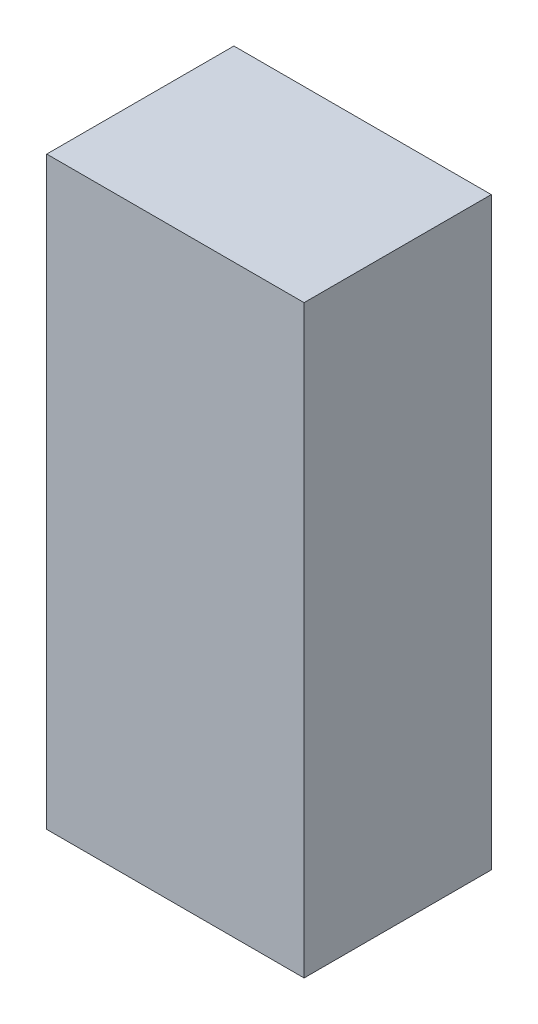
ISO-10303-21;
HEADER;
FILE_DESCRIPTION(('STEP AP214'),'2;1');
FILE_NAME('part.step','',(''),(''),'','','');
FILE_SCHEMA(('AUTOMOTIVE_DESIGN { 1 0 10303 214 1 1 1 1 }'));
ENDSEC;
DATA;
#1=APPLICATION_CONTEXT('core data for automotive mechanical design processes');
#2=APPLICATION_PROTOCOL_DEFINITION('international standard','automotive_design',2000,#1);
#3=PRODUCT_CONTEXT('',#1,'mechanical');
#4=PRODUCT('Part','Part','',(#3));
#5=PRODUCT_RELATED_PRODUCT_CATEGORY('part','',(#4));
#6=PRODUCT_DEFINITION_FORMATION('','',#4);
#7=PRODUCT_DEFINITION_CONTEXT('part definition',#1,'design');
#8=PRODUCT_DEFINITION('design','',#6,#7);
#9=PRODUCT_DEFINITION_SHAPE('','',#8);
#10=(LENGTH_UNIT() NAMED_UNIT(*) SI_UNIT(.MILLI.,.METRE.));
#11=(NAMED_UNIT(*) PLANE_ANGLE_UNIT() SI_UNIT($,.RADIAN.));
#12=(NAMED_UNIT(*) SI_UNIT($,.STERADIAN.) SOLID_ANGLE_UNIT());
#13=UNCERTAINTY_MEASURE_WITH_UNIT(LENGTH_MEASURE(1.E-05),#10,'distance_accuracy_value','');
#14=(GEOMETRIC_REPRESENTATION_CONTEXT(3) GLOBAL_UNCERTAINTY_ASSIGNED_CONTEXT((#13)) GLOBAL_UNIT_ASSIGNED_CONTEXT((#10,
#11,#12)) REPRESENTATION_CONTEXT('',''));
#15=CARTESIAN_POINT('',(0.,0.,0.));
#16=DIRECTION('',(0.,0.,1.));
#17=DIRECTION('',(1.,0.,0.));
#18=AXIS2_PLACEMENT_3D('',#15,#16,#17);
#19=CARTESIAN_POINT('',(33.,-75.,24.));
#20=DIRECTION('',(-1.,0.,0.));
#21=DIRECTION('',(0.,0.,1.));
#22=AXIS2_PLACEMENT_3D('',#19,#20,#21);
#23=PLANE('',#22);
#24=DIRECTION('',(0.,1.,0.));
#25=VECTOR('',#24,1.);
#26=CARTESIAN_POINT('',(33.,-75.,-24.));
#27=LINE('',#26,#25);
#28=CARTESIAN_POINT('',(33.,-75.,-24.));
#29=VERTEX_POINT('',#28);
#30=CARTESIAN_POINT('',(33.,75.,-24.));
#31=VERTEX_POINT('',#30);
#32=EDGE_CURVE('E112',#29,#31,#27,.T.);
#33=ORIENTED_EDGE('',*,*,#32,.T.);
#34=DIRECTION('',(0.,0.,-1.));
#35=VECTOR('',#34,1.);
#36=CARTESIAN_POINT('',(33.,75.,24.));
#37=LINE('',#36,#35);
#38=CARTESIAN_POINT('',(33.,75.,24.));
#39=VERTEX_POINT('',#38);
#40=EDGE_CURVE('E11',#39,#31,#37,.T.);
#41=ORIENTED_EDGE('',*,*,#40,.F.);
#42=DIRECTION('',(0.,1.,0.));
#43=VECTOR('',#42,1.);
#44=CARTESIAN_POINT('',(33.,-75.,24.));
#45=LINE('',#44,#43);
#46=CARTESIAN_POINT('',(33.,-75.,24.));
#47=VERTEX_POINT('',#46);
#48=EDGE_CURVE('E92',#47,#39,#45,.T.);
#49=ORIENTED_EDGE('',*,*,#48,.F.);
#50=DIRECTION('',(0.,0.,-1.));
#51=VECTOR('',#50,1.);
#52=CARTESIAN_POINT('',(33.,-75.,24.));
#53=LINE('',#52,#51);
#54=EDGE_CURVE('E110',#47,#29,#53,.T.);
#55=ORIENTED_EDGE('',*,*,#54,.T.);
#56=EDGE_LOOP('',(#33,#41,#49,#55));
#57=FACE_BOUND('',#56,.T.);
#58=ADVANCED_FACE('F43',(#57),#23,.F.);
#59=CARTESIAN_POINT('',(-33.,75.,24.));
#60=DIRECTION('',(0.,-1.,0.));
#61=DIRECTION('',(0.,0.,-1.));
#62=AXIS2_PLACEMENT_3D('',#59,#60,#61);
#63=PLANE('',#62);
#64=DIRECTION('',(-1.,0.,0.));
#65=VECTOR('',#64,1.);
#66=CARTESIAN_POINT('',(-33.,75.,-24.));
#67=LINE('',#66,#65);
#68=CARTESIAN_POINT('',(-33.,75.,-24.));
#69=VERTEX_POINT('',#68);
#70=EDGE_CURVE('E99',#31,#69,#67,.T.);
#71=ORIENTED_EDGE('',*,*,#70,.T.);
#72=DIRECTION('',(0.,0.,-1.));
#73=VECTOR('',#72,1.);
#74=CARTESIAN_POINT('',(-33.,75.,24.));
#75=LINE('',#74,#73);
#76=CARTESIAN_POINT('',(-33.,75.,24.));
#77=VERTEX_POINT('',#76);
#78=EDGE_CURVE('E55',#77,#69,#75,.T.);
#79=ORIENTED_EDGE('',*,*,#78,.F.);
#80=DIRECTION('',(-1.,0.,0.));
#81=VECTOR('',#80,1.);
#82=CARTESIAN_POINT('',(-33.,75.,24.));
#83=LINE('',#82,#81);
#84=EDGE_CURVE('E89',#39,#77,#83,.T.);
#85=ORIENTED_EDGE('',*,*,#84,.F.);
#86=ORIENTED_EDGE('',*,*,#40,.T.);
#87=EDGE_LOOP('',(#71,#79,#85,#86));
#88=FACE_BOUND('',#87,.T.);
#89=ADVANCED_FACE('F97',(#88),#63,.F.);
#90=CARTESIAN_POINT('',(-33.,-75.,24.));
#91=DIRECTION('',(1.,0.,0.));
#92=DIRECTION('',(0.,0.,-1.));
#93=AXIS2_PLACEMENT_3D('',#90,#91,#92);
#94=PLANE('',#93);
#95=DIRECTION('',(0.,-1.,0.));
#96=VECTOR('',#95,1.);
#97=CARTESIAN_POINT('',(-33.,-75.,-24.));
#98=LINE('',#97,#96);
#99=CARTESIAN_POINT('',(-33.,-75.,-24.));
#100=VERTEX_POINT('',#99);
#101=EDGE_CURVE('E80',#69,#100,#98,.T.);
#102=ORIENTED_EDGE('',*,*,#101,.T.);
#103=DIRECTION('',(0.,0.,-1.));
#104=VECTOR('',#103,1.);
#105=CARTESIAN_POINT('',(-33.,-75.,24.));
#106=LINE('',#105,#104);
#107=CARTESIAN_POINT('',(-33.,-75.,24.));
#108=VERTEX_POINT('',#107);
#109=EDGE_CURVE('E105',#108,#100,#106,.T.);
#110=ORIENTED_EDGE('',*,*,#109,.F.);
#111=DIRECTION('',(0.,-1.,0.));
#112=VECTOR('',#111,1.);
#113=CARTESIAN_POINT('',(-33.,-75.,24.));
#114=LINE('',#113,#112);
#115=EDGE_CURVE('E91',#77,#108,#114,.T.);
#116=ORIENTED_EDGE('',*,*,#115,.F.);
#117=ORIENTED_EDGE('',*,*,#78,.T.);
#118=EDGE_LOOP('',(#102,#110,#116,#117));
#119=FACE_BOUND('',#118,.T.);
#120=ADVANCED_FACE('F103',(#119),#94,.F.);
#121=CARTESIAN_POINT('',(-33.,-75.,24.));
#122=DIRECTION('',(0.,1.,0.));
#123=DIRECTION('',(0.,0.,1.));
#124=AXIS2_PLACEMENT_3D('',#121,#122,#123);
#125=PLANE('',#124);
#126=DIRECTION('',(1.,0.,0.));
#127=VECTOR('',#126,1.);
#128=CARTESIAN_POINT('',(-33.,-75.,-24.));
#129=LINE('',#128,#127);
#130=EDGE_CURVE('E81',#100,#29,#129,.T.);
#131=ORIENTED_EDGE('',*,*,#130,.T.);
#132=ORIENTED_EDGE('',*,*,#54,.F.);
#133=DIRECTION('',(1.,0.,0.));
#134=VECTOR('',#133,1.);
#135=CARTESIAN_POINT('',(-33.,-75.,24.));
#136=LINE('',#135,#134);
#137=EDGE_CURVE('E58',#108,#47,#136,.T.);
#138=ORIENTED_EDGE('',*,*,#137,.F.);
#139=ORIENTED_EDGE('',*,*,#109,.T.);
#140=EDGE_LOOP('',(#131,#132,#138,#139));
#141=FACE_BOUND('',#140,.T.);
#142=ADVANCED_FACE('F122',(#141),#125,.F.);
#143=CARTESIAN_POINT('',(0.,0.,24.));
#144=DIRECTION('',(0.,0.,-1.));
#145=DIRECTION('',(-1.,0.,0.));
#146=AXIS2_PLACEMENT_3D('',#143,#144,#145);
#147=PLANE('',#146);
#148=ORIENTED_EDGE('',*,*,#48,.T.);
#149=ORIENTED_EDGE('',*,*,#84,.T.);
#150=ORIENTED_EDGE('',*,*,#115,.T.);
#151=ORIENTED_EDGE('',*,*,#137,.T.);
#152=EDGE_LOOP('',(#148,#149,#150,#151));
#153=FACE_BOUND('',#152,.T.);
#154=ADVANCED_FACE('F93',(#153),#147,.F.);
#155=CARTESIAN_POINT('',(0.,0.,-24.));
#156=DIRECTION('',(0.,0.,-1.));
#157=DIRECTION('',(-1.,0.,0.));
#158=AXIS2_PLACEMENT_3D('',#155,#156,#157);
#159=PLANE('',#158);
#160=ORIENTED_EDGE('',*,*,#32,.F.);
#161=ORIENTED_EDGE('',*,*,#130,.F.);
#162=ORIENTED_EDGE('',*,*,#101,.F.);
#163=ORIENTED_EDGE('',*,*,#70,.F.);
#164=EDGE_LOOP('',(#160,#161,#162,#163));
#165=FACE_BOUND('',#164,.T.);
#166=ADVANCED_FACE('F130',(#165),#159,.T.);
#167=CLOSED_SHELL('',(#58,#89,#120,#142,#154,#166));
#168=MANIFOLD_SOLID_BREP('B2',#167);
#169=ADVANCED_BREP_SHAPE_REPRESENTATION('',(#18,#168),#14);
#170=SHAPE_DEFINITION_REPRESENTATION(#9,#169);
ENDSEC;
END-ISO-10303-21;
